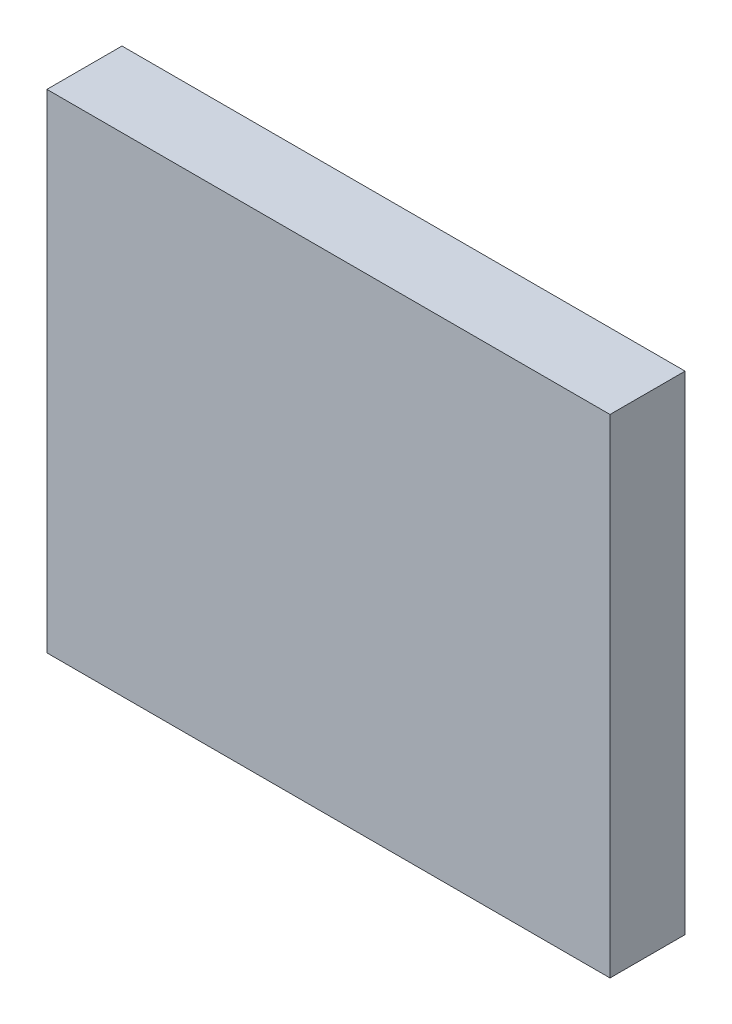
ISO-10303-21;
HEADER;
FILE_DESCRIPTION(('STEP AP214'),'2;1');
FILE_NAME('part.step','',(''),(''),'','','');
FILE_SCHEMA(('AUTOMOTIVE_DESIGN { 1 0 10303 214 1 1 1 1 }'));
ENDSEC;
DATA;
#1=APPLICATION_CONTEXT('core data for automotive mechanical design processes');
#2=APPLICATION_PROTOCOL_DEFINITION('international standard','automotive_design',2000,#1);
#3=PRODUCT_CONTEXT('',#1,'mechanical');
#4=PRODUCT('Part','Part','',(#3));
#5=PRODUCT_RELATED_PRODUCT_CATEGORY('part','',(#4));
#6=PRODUCT_DEFINITION_FORMATION('','',#4);
#7=PRODUCT_DEFINITION_CONTEXT('part definition',#1,'design');
#8=PRODUCT_DEFINITION('design','',#6,#7);
#9=PRODUCT_DEFINITION_SHAPE('','',#8);
#10=(LENGTH_UNIT() NAMED_UNIT(*) SI_UNIT(.MILLI.,.METRE.));
#11=(NAMED_UNIT(*) PLANE_ANGLE_UNIT() SI_UNIT($,.RADIAN.));
#12=(NAMED_UNIT(*) SI_UNIT($,.STERADIAN.) SOLID_ANGLE_UNIT());
#13=UNCERTAINTY_MEASURE_WITH_UNIT(LENGTH_MEASURE(1.E-05),#10,'distance_accuracy_value','');
#14=(GEOMETRIC_REPRESENTATION_CONTEXT(3) GLOBAL_UNCERTAINTY_ASSIGNED_CONTEXT((#13)) GLOBAL_UNIT_ASSIGNED_CONTEXT((#10,
#11,#12)) REPRESENTATION_CONTEXT('',''));
#15=CARTESIAN_POINT('',(0.,0.,0.));
#16=DIRECTION('',(0.,0.,1.));
#17=DIRECTION('',(1.,0.,0.));
#18=AXIS2_PLACEMENT_3D('',#15,#16,#17);
#19=CARTESIAN_POINT('',(47.625,41.275,12.7));
#20=DIRECTION('',(-1.,0.,0.));
#21=DIRECTION('',(0.,-1.,0.));
#22=AXIS2_PLACEMENT_3D('',#19,#20,#21);
#23=PLANE('',#22);
#24=DIRECTION('',(0.,1.,0.));
#25=VECTOR('',#24,1.);
#26=CARTESIAN_POINT('',(47.625,41.275,0.));
#27=LINE('',#26,#25);
#28=CARTESIAN_POINT('',(47.625,-41.275,0.));
#29=VERTEX_POINT('',#28);
#30=CARTESIAN_POINT('',(47.625,41.275,0.));
#31=VERTEX_POINT('',#30);
#32=EDGE_CURVE('E107',#29,#31,#27,.T.);
#33=ORIENTED_EDGE('',*,*,#32,.T.);
#34=DIRECTION('',(0.,0.,-1.));
#35=VECTOR('',#34,1.);
#36=CARTESIAN_POINT('',(47.625,41.275,12.7));
#37=LINE('',#36,#35);
#38=CARTESIAN_POINT('',(47.625,41.275,12.7));
#39=VERTEX_POINT('',#38);
#40=EDGE_CURVE('E11',#39,#31,#37,.T.);
#41=ORIENTED_EDGE('',*,*,#40,.F.);
#42=DIRECTION('',(0.,1.,0.));
#43=VECTOR('',#42,1.);
#44=CARTESIAN_POINT('',(47.625,41.275,12.7));
#45=LINE('',#44,#43);
#46=CARTESIAN_POINT('',(47.625,-41.275,12.7));
#47=VERTEX_POINT('',#46);
#48=EDGE_CURVE('E91',#47,#39,#45,.T.);
#49=ORIENTED_EDGE('',*,*,#48,.F.);
#50=DIRECTION('',(0.,0.,-1.));
#51=VECTOR('',#50,1.);
#52=CARTESIAN_POINT('',(47.625,-41.275,12.7));
#53=LINE('',#52,#51);
#54=EDGE_CURVE('E103',#47,#29,#53,.T.);
#55=ORIENTED_EDGE('',*,*,#54,.T.);
#56=EDGE_LOOP('',(#33,#41,#49,#55));
#57=FACE_BOUND('',#56,.T.);
#58=ADVANCED_FACE('F39',(#57),#23,.F.);
#59=CARTESIAN_POINT('',(-47.625,41.275,12.7));
#60=DIRECTION('',(0.,-1.,0.));
#61=DIRECTION('',(0.,0.,-1.));
#62=AXIS2_PLACEMENT_3D('',#59,#60,#61);
#63=PLANE('',#62);
#64=DIRECTION('',(-1.,0.,0.));
#65=VECTOR('',#64,1.);
#66=CARTESIAN_POINT('',(-47.625,41.275,0.));
#67=LINE('',#66,#65);
#68=CARTESIAN_POINT('',(-47.625,41.275,0.));
#69=VERTEX_POINT('',#68);
#70=EDGE_CURVE('E96',#31,#69,#67,.T.);
#71=ORIENTED_EDGE('',*,*,#70,.T.);
#72=DIRECTION('',(0.,0.,-1.));
#73=VECTOR('',#72,1.);
#74=CARTESIAN_POINT('',(-47.625,41.275,12.7));
#75=LINE('',#74,#73);
#76=CARTESIAN_POINT('',(-47.625,41.275,12.7));
#77=VERTEX_POINT('',#76);
#78=EDGE_CURVE('E48',#77,#69,#75,.T.);
#79=ORIENTED_EDGE('',*,*,#78,.F.);
#80=DIRECTION('',(-1.,0.,0.));
#81=VECTOR('',#80,1.);
#82=CARTESIAN_POINT('',(-47.625,41.275,12.7));
#83=LINE('',#82,#81);
#84=EDGE_CURVE('E86',#39,#77,#83,.T.);
#85=ORIENTED_EDGE('',*,*,#84,.F.);
#86=ORIENTED_EDGE('',*,*,#40,.T.);
#87=EDGE_LOOP('',(#71,#79,#85,#86));
#88=FACE_BOUND('',#87,.T.);
#89=ADVANCED_FACE('F95',(#88),#63,.F.);
#90=CARTESIAN_POINT('',(-47.625,41.275,12.7));
#91=DIRECTION('',(1.,0.,0.));
#92=DIRECTION('',(0.,1.,0.));
#93=AXIS2_PLACEMENT_3D('',#90,#91,#92);
#94=PLANE('',#93);
#95=DIRECTION('',(0.,-1.,0.));
#96=VECTOR('',#95,1.);
#97=CARTESIAN_POINT('',(-47.625,41.275,0.));
#98=LINE('',#97,#96);
#99=CARTESIAN_POINT('',(-47.625,-41.275,0.));
#100=VERTEX_POINT('',#99);
#101=EDGE_CURVE('E73',#69,#100,#98,.T.);
#102=ORIENTED_EDGE('',*,*,#101,.T.);
#103=DIRECTION('',(0.,0.,-1.));
#104=VECTOR('',#103,1.);
#105=CARTESIAN_POINT('',(-47.625,-41.275,12.7));
#106=LINE('',#105,#104);
#107=CARTESIAN_POINT('',(-47.625,-41.275,12.7));
#108=VERTEX_POINT('',#107);
#109=EDGE_CURVE('E98',#108,#100,#106,.T.);
#110=ORIENTED_EDGE('',*,*,#109,.F.);
#111=DIRECTION('',(0.,-1.,0.));
#112=VECTOR('',#111,1.);
#113=CARTESIAN_POINT('',(-47.625,41.275,12.7));
#114=LINE('',#113,#112);
#115=EDGE_CURVE('E89',#77,#108,#114,.T.);
#116=ORIENTED_EDGE('',*,*,#115,.F.);
#117=ORIENTED_EDGE('',*,*,#78,.T.);
#118=EDGE_LOOP('',(#102,#110,#116,#117));
#119=FACE_BOUND('',#118,.T.);
#120=ADVANCED_FACE('F99',(#119),#94,.F.);
#121=CARTESIAN_POINT('',(-47.625,-41.275,12.7));
#122=DIRECTION('',(0.,1.,0.));
#123=DIRECTION('',(0.,0.,1.));
#124=AXIS2_PLACEMENT_3D('',#121,#122,#123);
#125=PLANE('',#124);
#126=DIRECTION('',(1.,0.,0.));
#127=VECTOR('',#126,1.);
#128=CARTESIAN_POINT('',(-47.625,-41.275,0.));
#129=LINE('',#128,#127);
#130=EDGE_CURVE('E79',#100,#29,#129,.T.);
#131=ORIENTED_EDGE('',*,*,#130,.T.);
#132=ORIENTED_EDGE('',*,*,#54,.F.);
#133=DIRECTION('',(1.,0.,0.));
#134=VECTOR('',#133,1.);
#135=CARTESIAN_POINT('',(-47.625,-41.275,12.7));
#136=LINE('',#135,#134);
#137=EDGE_CURVE('E56',#108,#47,#136,.T.);
#138=ORIENTED_EDGE('',*,*,#137,.F.);
#139=ORIENTED_EDGE('',*,*,#109,.T.);
#140=EDGE_LOOP('',(#131,#132,#138,#139));
#141=FACE_BOUND('',#140,.T.);
#142=ADVANCED_FACE('F120',(#141),#125,.F.);
#143=CARTESIAN_POINT('',(0.,0.,12.7));
#144=DIRECTION('',(0.,0.,1.));
#145=DIRECTION('',(1.,0.,0.));
#146=AXIS2_PLACEMENT_3D('',#143,#144,#145);
#147=PLANE('',#146);
#148=ORIENTED_EDGE('',*,*,#48,.T.);
#149=ORIENTED_EDGE('',*,*,#84,.T.);
#150=ORIENTED_EDGE('',*,*,#115,.T.);
#151=ORIENTED_EDGE('',*,*,#137,.T.);
#152=EDGE_LOOP('',(#148,#149,#150,#151));
#153=FACE_BOUND('',#152,.T.);
#154=ADVANCED_FACE('F87',(#153),#147,.T.);
#155=CARTESIAN_POINT('',(0.,0.,0.));
#156=DIRECTION('',(0.,0.,1.));
#157=DIRECTION('',(1.,0.,0.));
#158=AXIS2_PLACEMENT_3D('',#155,#156,#157);
#159=PLANE('',#158);
#160=ORIENTED_EDGE('',*,*,#32,.F.);
#161=ORIENTED_EDGE('',*,*,#130,.F.);
#162=ORIENTED_EDGE('',*,*,#101,.F.);
#163=ORIENTED_EDGE('',*,*,#70,.F.);
#164=EDGE_LOOP('',(#160,#161,#162,#163));
#165=FACE_BOUND('',#164,.T.);
#166=ADVANCED_FACE('F123',(#165),#159,.F.);
#167=CLOSED_SHELL('',(#58,#89,#120,#142,#154,#166));
#168=MANIFOLD_SOLID_BREP('B2',#167);
#169=ADVANCED_BREP_SHAPE_REPRESENTATION('',(#18,#168),#14);
#170=SHAPE_DEFINITION_REPRESENTATION(#9,#169);
ENDSEC;
END-ISO-10303-21;
